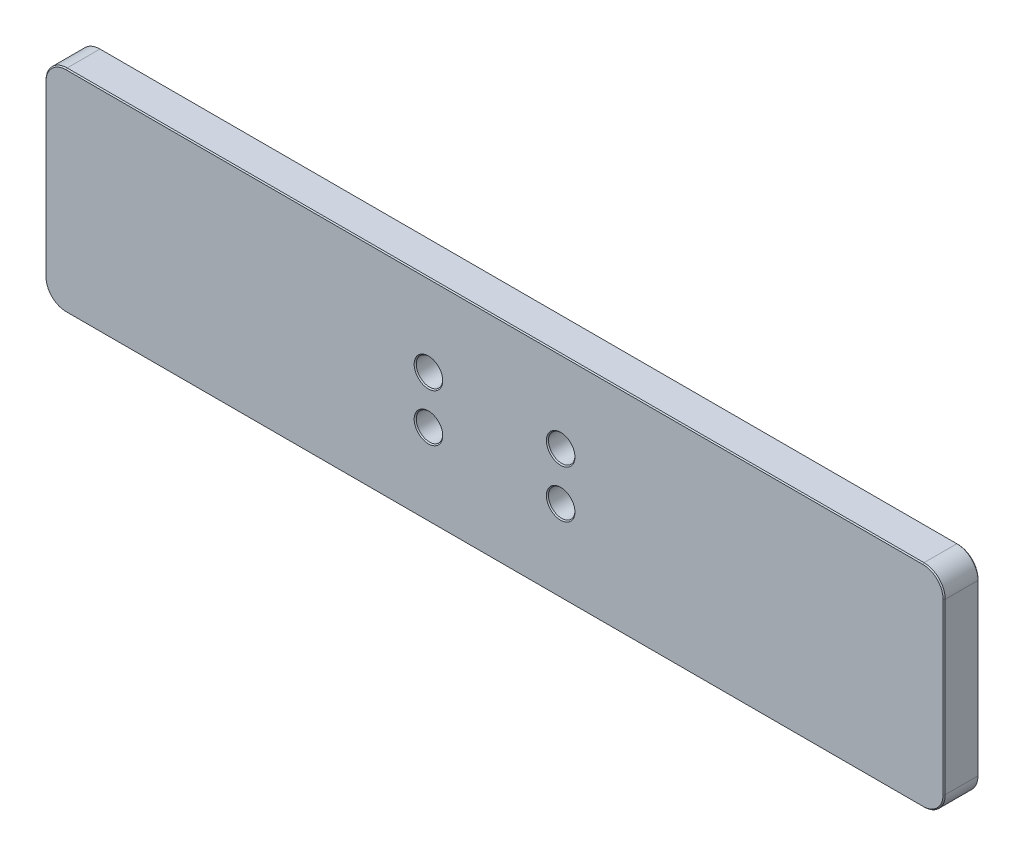
ISO-10303-21;
HEADER;
FILE_DESCRIPTION(('STEP AP214'),'2;1');
FILE_NAME('part.step','',(''),(''),'','','');
FILE_SCHEMA(('AUTOMOTIVE_DESIGN { 1 0 10303 214 1 1 1 1 }'));
ENDSEC;
DATA;
#1=APPLICATION_CONTEXT('core data for automotive mechanical design processes');
#2=APPLICATION_PROTOCOL_DEFINITION('international standard','automotive_design',2000,#1);
#3=PRODUCT_CONTEXT('',#1,'mechanical');
#4=PRODUCT('Part','Part','',(#3));
#5=PRODUCT_RELATED_PRODUCT_CATEGORY('part','',(#4));
#6=PRODUCT_DEFINITION_FORMATION('','',#4);
#7=PRODUCT_DEFINITION_CONTEXT('part definition',#1,'design');
#8=PRODUCT_DEFINITION('design','',#6,#7);
#9=PRODUCT_DEFINITION_SHAPE('','',#8);
#10=(LENGTH_UNIT() NAMED_UNIT(*) SI_UNIT(.MILLI.,.METRE.));
#11=(NAMED_UNIT(*) PLANE_ANGLE_UNIT() SI_UNIT($,.RADIAN.));
#12=(NAMED_UNIT(*) SI_UNIT($,.STERADIAN.) SOLID_ANGLE_UNIT());
#13=UNCERTAINTY_MEASURE_WITH_UNIT(LENGTH_MEASURE(1.E-05),#10,'distance_accuracy_value','');
#14=(GEOMETRIC_REPRESENTATION_CONTEXT(3) GLOBAL_UNCERTAINTY_ASSIGNED_CONTEXT((#13)) GLOBAL_UNIT_ASSIGNED_CONTEXT((#10,
#11,#12)) REPRESENTATION_CONTEXT('',''));
#15=CARTESIAN_POINT('',(0.,0.,0.));
#16=DIRECTION('',(0.,0.,1.));
#17=DIRECTION('',(1.,0.,0.));
#18=AXIS2_PLACEMENT_3D('',#15,#16,#17);
#19=CARTESIAN_POINT('',(0.,0.,8.382));
#20=DIRECTION('',(0.,0.,1.));
#21=DIRECTION('',(1.,0.,0.));
#22=AXIS2_PLACEMENT_3D('',#19,#20,#21);
#23=PLANE('',#22);
#24=CARTESIAN_POINT('',(-15.875,-5.715,8.382));
#25=DIRECTION('',(0.,0.,1.));
#26=DIRECTION('',(1.,0.,0.));
#27=AXIS2_PLACEMENT_3D('',#24,#25,#26);
#28=CIRCLE('',#27,3.42899999999999);
#29=CARTESIAN_POINT('',(-12.446,-5.715,8.382));
#30=VERTEX_POINT('',#29);
#31=EDGE_CURVE('E11',#30,#30,#28,.F.);
#32=ORIENTED_EDGE('',*,*,#31,.T.);
#33=EDGE_LOOP('',(#32));
#34=FACE_BOUND('',#33,.T.);
#35=CARTESIAN_POINT('',(15.875,5.715,8.382));
#36=DIRECTION('',(0.,0.,1.));
#37=DIRECTION('',(1.,0.,0.));
#38=AXIS2_PLACEMENT_3D('',#35,#36,#37);
#39=CIRCLE('',#38,3.42899999999999);
#40=CARTESIAN_POINT('',(19.304,5.715,8.382));
#41=VERTEX_POINT('',#40);
#42=EDGE_CURVE('E42',#41,#41,#39,.F.);
#43=ORIENTED_EDGE('',*,*,#42,.T.);
#44=EDGE_LOOP('',(#43));
#45=FACE_BOUND('',#44,.T.);
#46=DIRECTION('',(-1.,0.,0.));
#47=VECTOR('',#46,1.);
#48=CARTESIAN_POINT('',(-102.87,25.146,8.382));
#49=LINE('',#48,#47);
#50=CARTESIAN_POINT('',(102.87,25.146,8.382));
#51=VERTEX_POINT('',#50);
#52=CARTESIAN_POINT('',(-102.87,25.146,8.382));
#53=VERTEX_POINT('',#52);
#54=EDGE_CURVE('E50',#51,#53,#49,.T.);
#55=ORIENTED_EDGE('',*,*,#54,.T.);
#56=CARTESIAN_POINT('',(-102.87,20.32,8.382));
#57=DIRECTION('',(0.,0.,1.));
#58=DIRECTION('',(1.,0.,0.));
#59=AXIS2_PLACEMENT_3D('',#56,#57,#58);
#60=CIRCLE('',#59,4.82599999999997);
#61=CARTESIAN_POINT('',(-107.696,20.32,8.382));
#62=VERTEX_POINT('',#61);
#63=EDGE_CURVE('E265',#53,#62,#60,.T.);
#64=ORIENTED_EDGE('',*,*,#63,.T.);
#65=DIRECTION('',(0.,-1.,0.));
#66=VECTOR('',#65,1.);
#67=CARTESIAN_POINT('',(-107.696,-20.32,8.382));
#68=LINE('',#67,#66);
#69=CARTESIAN_POINT('',(-107.696,-20.32,8.382));
#70=VERTEX_POINT('',#69);
#71=EDGE_CURVE('E253',#62,#70,#68,.T.);
#72=ORIENTED_EDGE('',*,*,#71,.T.);
#73=CARTESIAN_POINT('',(-102.87,-20.32,8.382));
#74=DIRECTION('',(0.,0.,1.));
#75=DIRECTION('',(1.,0.,0.));
#76=AXIS2_PLACEMENT_3D('',#73,#74,#75);
#77=CIRCLE('',#76,4.82599999999997);
#78=CARTESIAN_POINT('',(-102.87,-25.146,8.382));
#79=VERTEX_POINT('',#78);
#80=EDGE_CURVE('E255',#70,#79,#77,.T.);
#81=ORIENTED_EDGE('',*,*,#80,.T.);
#82=DIRECTION('',(1.,0.,0.));
#83=VECTOR('',#82,1.);
#84=CARTESIAN_POINT('',(102.87,-25.146,8.382));
#85=LINE('',#84,#83);
#86=CARTESIAN_POINT('',(102.87,-25.146,8.382));
#87=VERTEX_POINT('',#86);
#88=EDGE_CURVE('E257',#79,#87,#85,.T.);
#89=ORIENTED_EDGE('',*,*,#88,.T.);
#90=CARTESIAN_POINT('',(102.87,-20.32,8.382));
#91=DIRECTION('',(0.,0.,1.));
#92=DIRECTION('',(1.,0.,0.));
#93=AXIS2_PLACEMENT_3D('',#90,#91,#92);
#94=CIRCLE('',#93,4.82599999999997);
#95=CARTESIAN_POINT('',(107.696,-20.32,8.382));
#96=VERTEX_POINT('',#95);
#97=EDGE_CURVE('E259',#87,#96,#94,.T.);
#98=ORIENTED_EDGE('',*,*,#97,.T.);
#99=DIRECTION('',(0.,1.,0.));
#100=VECTOR('',#99,1.);
#101=CARTESIAN_POINT('',(107.696,20.32,8.382));
#102=LINE('',#101,#100);
#103=CARTESIAN_POINT('',(107.696,20.32,8.382));
#104=VERTEX_POINT('',#103);
#105=EDGE_CURVE('E261',#96,#104,#102,.T.);
#106=ORIENTED_EDGE('',*,*,#105,.T.);
#107=CARTESIAN_POINT('',(102.87,20.32,8.382));
#108=DIRECTION('',(0.,0.,1.));
#109=DIRECTION('',(1.,0.,0.));
#110=AXIS2_PLACEMENT_3D('',#107,#108,#109);
#111=CIRCLE('',#110,4.82599999999997);
#112=EDGE_CURVE('E55',#104,#51,#111,.T.);
#113=ORIENTED_EDGE('',*,*,#112,.T.);
#114=EDGE_LOOP('',(#55,#64,#72,#81,#89,#98,#106,#113));
#115=FACE_BOUND('',#114,.T.);
#116=CARTESIAN_POINT('',(-15.875,5.715,8.382));
#117=DIRECTION('',(0.,0.,1.));
#118=DIRECTION('',(1.,0.,0.));
#119=AXIS2_PLACEMENT_3D('',#116,#117,#118);
#120=CIRCLE('',#119,3.42899999999999);
#121=CARTESIAN_POINT('',(-12.446,5.715,8.382));
#122=VERTEX_POINT('',#121);
#123=EDGE_CURVE('E250',#122,#122,#120,.F.);
#124=ORIENTED_EDGE('',*,*,#123,.T.);
#125=EDGE_LOOP('',(#124));
#126=FACE_BOUND('',#125,.T.);
#127=CARTESIAN_POINT('',(15.875,-5.715,8.382));
#128=DIRECTION('',(0.,0.,1.));
#129=DIRECTION('',(1.,0.,0.));
#130=AXIS2_PLACEMENT_3D('',#127,#128,#129);
#131=CIRCLE('',#130,3.42899999999999);
#132=CARTESIAN_POINT('',(19.304,-5.715,8.382));
#133=VERTEX_POINT('',#132);
#134=EDGE_CURVE('E247',#133,#133,#131,.F.);
#135=ORIENTED_EDGE('',*,*,#134,.T.);
#136=EDGE_LOOP('',(#135));
#137=FACE_BOUND('',#136,.T.);
#138=ADVANCED_FACE('F33',(#34,#45,#115,#126,#137),#23,.T.);
#139=CARTESIAN_POINT('',(0.,0.,0.));
#140=DIRECTION('',(0.,0.,1.));
#141=DIRECTION('',(1.,0.,0.));
#142=AXIS2_PLACEMENT_3D('',#139,#140,#141);
#143=PLANE('',#142);
#144=CARTESIAN_POINT('',(-15.875,-5.715,0.));
#145=DIRECTION('',(0.,0.,1.));
#146=DIRECTION('',(1.,0.,0.));
#147=AXIS2_PLACEMENT_3D('',#144,#145,#146);
#148=CIRCLE('',#147,3.42900000000004);
#149=CARTESIAN_POINT('',(-12.446,-5.715,0.));
#150=VERTEX_POINT('',#149);
#151=EDGE_CURVE('E188',#150,#150,#148,.T.);
#152=ORIENTED_EDGE('',*,*,#151,.T.);
#153=EDGE_LOOP('',(#152));
#154=FACE_BOUND('',#153,.T.);
#155=CARTESIAN_POINT('',(15.875,-5.715,0.));
#156=DIRECTION('',(0.,0.,1.));
#157=DIRECTION('',(1.,0.,0.));
#158=AXIS2_PLACEMENT_3D('',#155,#156,#157);
#159=CIRCLE('',#158,3.42900000000004);
#160=CARTESIAN_POINT('',(19.304,-5.715,0.));
#161=VERTEX_POINT('',#160);
#162=EDGE_CURVE('E185',#161,#161,#159,.T.);
#163=ORIENTED_EDGE('',*,*,#162,.T.);
#164=EDGE_LOOP('',(#163));
#165=FACE_BOUND('',#164,.T.);
#166=CARTESIAN_POINT('',(15.875,5.715,0.));
#167=DIRECTION('',(0.,0.,1.));
#168=DIRECTION('',(1.,0.,0.));
#169=AXIS2_PLACEMENT_3D('',#166,#167,#168);
#170=CIRCLE('',#169,3.42900000000004);
#171=CARTESIAN_POINT('',(19.304,5.715,0.));
#172=VERTEX_POINT('',#171);
#173=EDGE_CURVE('E177',#172,#172,#170,.T.);
#174=ORIENTED_EDGE('',*,*,#173,.T.);
#175=EDGE_LOOP('',(#174));
#176=FACE_BOUND('',#175,.T.);
#177=CARTESIAN_POINT('',(-15.875,5.715,0.));
#178=DIRECTION('',(0.,0.,1.));
#179=DIRECTION('',(1.,0.,0.));
#180=AXIS2_PLACEMENT_3D('',#177,#178,#179);
#181=CIRCLE('',#180,3.42900000000004);
#182=CARTESIAN_POINT('',(-12.446,5.715,0.));
#183=VERTEX_POINT('',#182);
#184=EDGE_CURVE('E174',#183,#183,#181,.T.);
#185=ORIENTED_EDGE('',*,*,#184,.T.);
#186=EDGE_LOOP('',(#185));
#187=FACE_BOUND('',#186,.T.);
#188=DIRECTION('',(0.,-1.,0.));
#189=VECTOR('',#188,1.);
#190=CARTESIAN_POINT('',(107.696,0.,0.));
#191=LINE('',#190,#189);
#192=CARTESIAN_POINT('',(107.696,20.32,0.));
#193=VERTEX_POINT('',#192);
#194=CARTESIAN_POINT('',(107.696,-20.32,0.));
#195=VERTEX_POINT('',#194);
#196=EDGE_CURVE('E172',#193,#195,#191,.T.);
#197=ORIENTED_EDGE('',*,*,#196,.T.);
#198=CARTESIAN_POINT('',(102.87,-20.32,0.));
#199=DIRECTION('',(0.,0.,1.));
#200=DIRECTION('',(1.,0.,0.));
#201=AXIS2_PLACEMENT_3D('',#198,#199,#200);
#202=CIRCLE('',#201,4.82600000000002);
#203=CARTESIAN_POINT('',(102.87,-25.146,0.));
#204=VERTEX_POINT('',#203);
#205=EDGE_CURVE('E153',#195,#204,#202,.F.);
#206=ORIENTED_EDGE('',*,*,#205,.T.);
#207=DIRECTION('',(-1.,0.,0.));
#208=VECTOR('',#207,1.);
#209=CARTESIAN_POINT('',(0.,-25.146,0.));
#210=LINE('',#209,#208);
#211=CARTESIAN_POINT('',(-102.87,-25.146,0.));
#212=VERTEX_POINT('',#211);
#213=EDGE_CURVE('E161',#204,#212,#210,.T.);
#214=ORIENTED_EDGE('',*,*,#213,.T.);
#215=CARTESIAN_POINT('',(-102.87,-20.32,0.));
#216=DIRECTION('',(0.,0.,1.));
#217=DIRECTION('',(1.,0.,0.));
#218=AXIS2_PLACEMENT_3D('',#215,#216,#217);
#219=CIRCLE('',#218,4.82600000000002);
#220=CARTESIAN_POINT('',(-107.696,-20.32,0.));
#221=VERTEX_POINT('',#220);
#222=EDGE_CURVE('E167',#212,#221,#219,.F.);
#223=ORIENTED_EDGE('',*,*,#222,.T.);
#224=DIRECTION('',(0.,1.,0.));
#225=VECTOR('',#224,1.);
#226=CARTESIAN_POINT('',(-107.696,0.,0.));
#227=LINE('',#226,#225);
#228=CARTESIAN_POINT('',(-107.696,20.32,0.));
#229=VERTEX_POINT('',#228);
#230=EDGE_CURVE('E350',#221,#229,#227,.T.);
#231=ORIENTED_EDGE('',*,*,#230,.T.);
#232=CARTESIAN_POINT('',(-102.87,20.32,0.));
#233=DIRECTION('',(0.,0.,1.));
#234=DIRECTION('',(1.,0.,0.));
#235=AXIS2_PLACEMENT_3D('',#232,#233,#234);
#236=CIRCLE('',#235,4.82600000000002);
#237=CARTESIAN_POINT('',(-102.87,25.146,0.));
#238=VERTEX_POINT('',#237);
#239=EDGE_CURVE('E352',#229,#238,#236,.F.);
#240=ORIENTED_EDGE('',*,*,#239,.T.);
#241=DIRECTION('',(1.,0.,0.));
#242=VECTOR('',#241,1.);
#243=CARTESIAN_POINT('',(0.,25.146,0.));
#244=LINE('',#243,#242);
#245=CARTESIAN_POINT('',(102.87,25.146,0.));
#246=VERTEX_POINT('',#245);
#247=EDGE_CURVE('E354',#238,#246,#244,.T.);
#248=ORIENTED_EDGE('',*,*,#247,.T.);
#249=CARTESIAN_POINT('',(102.87,20.32,0.));
#250=DIRECTION('',(0.,0.,1.));
#251=DIRECTION('',(1.,0.,0.));
#252=AXIS2_PLACEMENT_3D('',#249,#250,#251);
#253=CIRCLE('',#252,4.82600000000002);
#254=EDGE_CURVE('E179',#246,#193,#253,.F.);
#255=ORIENTED_EDGE('',*,*,#254,.T.);
#256=EDGE_LOOP('',(#197,#206,#214,#223,#231,#240,#248,#255));
#257=FACE_BOUND('',#256,.T.);
#258=ADVANCED_FACE('F170',(#154,#165,#176,#187,#257),#143,.F.);
#259=CARTESIAN_POINT('',(-107.95,-25.4,8.382));
#260=DIRECTION('',(1.,0.,0.));
#261=DIRECTION('',(0.,0.,-1.));
#262=AXIS2_PLACEMENT_3D('',#259,#260,#261);
#263=PLANE('',#262);
#264=DIRECTION('',(0.,0.,-1.));
#265=VECTOR('',#264,1.);
#266=CARTESIAN_POINT('',(-107.95,20.32,8.382));
#267=LINE('',#266,#265);
#268=CARTESIAN_POINT('',(-107.95,20.32,8.128));
#269=VERTEX_POINT('',#268);
#270=CARTESIAN_POINT('',(-107.95,20.32,0.253999999999976));
#271=VERTEX_POINT('',#270);
#272=EDGE_CURVE('E332',#269,#271,#267,.T.);
#273=ORIENTED_EDGE('',*,*,#272,.T.);
#274=DIRECTION('',(0.,-1.,0.));
#275=VECTOR('',#274,1.);
#276=CARTESIAN_POINT('',(-107.95,-25.4,0.253999999999976));
#277=LINE('',#276,#275);
#278=CARTESIAN_POINT('',(-107.95,-20.32,0.253999999999976));
#279=VERTEX_POINT('',#278);
#280=EDGE_CURVE('E237',#271,#279,#277,.T.);
#281=ORIENTED_EDGE('',*,*,#280,.T.);
#282=DIRECTION('',(0.,0.,-1.));
#283=VECTOR('',#282,1.);
#284=CARTESIAN_POINT('',(-107.95,-20.32,8.382));
#285=LINE('',#284,#283);
#286=CARTESIAN_POINT('',(-107.95,-20.32,8.128));
#287=VERTEX_POINT('',#286);
#288=EDGE_CURVE('E337',#279,#287,#285,.F.);
#289=ORIENTED_EDGE('',*,*,#288,.T.);
#290=DIRECTION('',(0.,1.,0.));
#291=VECTOR('',#290,1.);
#292=CARTESIAN_POINT('',(-107.95,20.32,8.128));
#293=LINE('',#292,#291);
#294=EDGE_CURVE('E235',#287,#269,#293,.T.);
#295=ORIENTED_EDGE('',*,*,#294,.T.);
#296=EDGE_LOOP('',(#273,#281,#289,#295));
#297=FACE_BOUND('',#296,.T.);
#298=ADVANCED_FACE('F395',(#297),#263,.F.);
#299=CARTESIAN_POINT('',(107.95,-25.4,8.382));
#300=DIRECTION('',(0.,1.,0.));
#301=DIRECTION('',(-1.,0.,0.));
#302=AXIS2_PLACEMENT_3D('',#299,#300,#301);
#303=PLANE('',#302);
#304=DIRECTION('',(0.,0.,-1.));
#305=VECTOR('',#304,1.);
#306=CARTESIAN_POINT('',(-102.87,-25.4,8.382));
#307=LINE('',#306,#305);
#308=CARTESIAN_POINT('',(-102.87,-25.4,8.128));
#309=VERTEX_POINT('',#308);
#310=CARTESIAN_POINT('',(-102.87,-25.4,0.253999999999976));
#311=VERTEX_POINT('',#310);
#312=EDGE_CURVE('E330',#309,#311,#307,.T.);
#313=ORIENTED_EDGE('',*,*,#312,.T.);
#314=DIRECTION('',(1.,0.,0.));
#315=VECTOR('',#314,1.);
#316=CARTESIAN_POINT('',(107.95,-25.4,0.253999999999976));
#317=LINE('',#316,#315);
#318=CARTESIAN_POINT('',(102.87,-25.4,0.253999999999976));
#319=VERTEX_POINT('',#318);
#320=EDGE_CURVE('E245',#311,#319,#317,.T.);
#321=ORIENTED_EDGE('',*,*,#320,.T.);
#322=DIRECTION('',(0.,0.,-1.));
#323=VECTOR('',#322,1.);
#324=CARTESIAN_POINT('',(102.87,-25.4,8.382));
#325=LINE('',#324,#323);
#326=CARTESIAN_POINT('',(102.87,-25.4,8.128));
#327=VERTEX_POINT('',#326);
#328=EDGE_CURVE('E286',#319,#327,#325,.F.);
#329=ORIENTED_EDGE('',*,*,#328,.T.);
#330=DIRECTION('',(-1.,0.,0.));
#331=VECTOR('',#330,1.);
#332=CARTESIAN_POINT('',(-102.87,-25.4,8.128));
#333=LINE('',#332,#331);
#334=EDGE_CURVE('E243',#327,#309,#333,.T.);
#335=ORIENTED_EDGE('',*,*,#334,.T.);
#336=EDGE_LOOP('',(#313,#321,#329,#335));
#337=FACE_BOUND('',#336,.T.);
#338=ADVANCED_FACE('F328',(#337),#303,.F.);
#339=CARTESIAN_POINT('',(107.95,-25.4,8.382));
#340=DIRECTION('',(-1.,0.,0.));
#341=DIRECTION('',(0.,0.,1.));
#342=AXIS2_PLACEMENT_3D('',#339,#340,#341);
#343=PLANE('',#342);
#344=DIRECTION('',(0.,0.,-1.));
#345=VECTOR('',#344,1.);
#346=CARTESIAN_POINT('',(107.95,-20.32,8.382));
#347=LINE('',#346,#345);
#348=CARTESIAN_POINT('',(107.95,-20.32,8.128));
#349=VERTEX_POINT('',#348);
#350=CARTESIAN_POINT('',(107.95,-20.32,0.253999999999976));
#351=VERTEX_POINT('',#350);
#352=EDGE_CURVE('E325',#349,#351,#347,.T.);
#353=ORIENTED_EDGE('',*,*,#352,.T.);
#354=DIRECTION('',(0.,1.,0.));
#355=VECTOR('',#354,1.);
#356=CARTESIAN_POINT('',(107.95,-25.4,0.253999999999976));
#357=LINE('',#356,#355);
#358=CARTESIAN_POINT('',(107.95,20.32,0.253999999999976));
#359=VERTEX_POINT('',#358);
#360=EDGE_CURVE('E220',#351,#359,#357,.T.);
#361=ORIENTED_EDGE('',*,*,#360,.T.);
#362=DIRECTION('',(0.,0.,-1.));
#363=VECTOR('',#362,1.);
#364=CARTESIAN_POINT('',(107.95,20.32,8.382));
#365=LINE('',#364,#363);
#366=CARTESIAN_POINT('',(107.95,20.32,8.128));
#367=VERTEX_POINT('',#366);
#368=EDGE_CURVE('E340',#359,#367,#365,.F.);
#369=ORIENTED_EDGE('',*,*,#368,.T.);
#370=DIRECTION('',(0.,-1.,0.));
#371=VECTOR('',#370,1.);
#372=CARTESIAN_POINT('',(107.95,-20.32,8.128));
#373=LINE('',#372,#371);
#374=EDGE_CURVE('E218',#367,#349,#373,.T.);
#375=ORIENTED_EDGE('',*,*,#374,.T.);
#376=EDGE_LOOP('',(#353,#361,#369,#375));
#377=FACE_BOUND('',#376,.T.);
#378=ADVANCED_FACE('F367',(#377),#343,.F.);
#379=CARTESIAN_POINT('',(107.95,25.4,8.382));
#380=DIRECTION('',(0.,-1.,0.));
#381=DIRECTION('',(1.,0.,0.));
#382=AXIS2_PLACEMENT_3D('',#379,#380,#381);
#383=PLANE('',#382);
#384=DIRECTION('',(0.,0.,-1.));
#385=VECTOR('',#384,1.);
#386=CARTESIAN_POINT('',(102.87,25.4,8.382));
#387=LINE('',#386,#385);
#388=CARTESIAN_POINT('',(102.87,25.4,8.128));
#389=VERTEX_POINT('',#388);
#390=CARTESIAN_POINT('',(102.87,25.4,0.253999999999976));
#391=VERTEX_POINT('',#390);
#392=EDGE_CURVE('E168',#389,#391,#387,.T.);
#393=ORIENTED_EDGE('',*,*,#392,.T.);
#394=DIRECTION('',(-1.,0.,0.));
#395=VECTOR('',#394,1.);
#396=CARTESIAN_POINT('',(107.95,25.4,0.253999999999976));
#397=LINE('',#396,#395);
#398=CARTESIAN_POINT('',(-102.87,25.4,0.253999999999976));
#399=VERTEX_POINT('',#398);
#400=EDGE_CURVE('E228',#391,#399,#397,.T.);
#401=ORIENTED_EDGE('',*,*,#400,.T.);
#402=DIRECTION('',(0.,0.,-1.));
#403=VECTOR('',#402,1.);
#404=CARTESIAN_POINT('',(-102.87,25.4,8.382));
#405=LINE('',#404,#403);
#406=CARTESIAN_POINT('',(-102.87,25.4,8.128));
#407=VERTEX_POINT('',#406);
#408=EDGE_CURVE('E344',#399,#407,#405,.F.);
#409=ORIENTED_EDGE('',*,*,#408,.T.);
#410=DIRECTION('',(1.,0.,0.));
#411=VECTOR('',#410,1.);
#412=CARTESIAN_POINT('',(102.87,25.4,8.128));
#413=LINE('',#412,#411);
#414=EDGE_CURVE('E226',#407,#389,#413,.T.);
#415=ORIENTED_EDGE('',*,*,#414,.T.);
#416=EDGE_LOOP('',(#393,#401,#409,#415));
#417=FACE_BOUND('',#416,.T.);
#418=ADVANCED_FACE('F411',(#417),#383,.F.);
#419=CARTESIAN_POINT('',(-15.875,5.715,8.382));
#420=DIRECTION('',(0.,0.,-1.));
#421=DIRECTION('',(-1.,0.,0.));
#422=AXIS2_PLACEMENT_3D('',#419,#420,#421);
#423=CYLINDRICAL_SURFACE('',#422,3.175);
#424=CARTESIAN_POINT('',(-15.875,5.715,0.254000000000025));
#425=DIRECTION('',(0.,0.,1.));
#426=DIRECTION('',(1.,0.,0.));
#427=AXIS2_PLACEMENT_3D('',#424,#425,#426);
#428=CIRCLE('',#427,3.175);
#429=CARTESIAN_POINT('',(-12.7,5.715,0.254000000000025));
#430=VERTEX_POINT('',#429);
#431=EDGE_CURVE('E212',#430,#430,#428,.F.);
#432=ORIENTED_EDGE('',*,*,#431,.T.);
#433=EDGE_LOOP('',(#432));
#434=FACE_BOUND('',#433,.T.);
#435=CARTESIAN_POINT('',(-15.875,5.715,8.12800000000001));
#436=DIRECTION('',(0.,0.,1.));
#437=DIRECTION('',(1.,0.,0.));
#438=AXIS2_PLACEMENT_3D('',#435,#436,#437);
#439=CIRCLE('',#438,3.175);
#440=CARTESIAN_POINT('',(-12.7,5.715,8.12800000000001));
#441=VERTEX_POINT('',#440);
#442=EDGE_CURVE('E209',#441,#441,#439,.T.);
#443=ORIENTED_EDGE('',*,*,#442,.T.);
#444=EDGE_LOOP('',(#443));
#445=FACE_BOUND('',#444,.T.);
#446=ADVANCED_FACE('F413',(#434,#445),#423,.F.);
#447=CARTESIAN_POINT('',(15.875,5.715,8.382));
#448=DIRECTION('',(0.,0.,-1.));
#449=DIRECTION('',(-1.,0.,0.));
#450=AXIS2_PLACEMENT_3D('',#447,#448,#449);
#451=CYLINDRICAL_SURFACE('',#450,3.175);
#452=CARTESIAN_POINT('',(15.875,5.715,0.254000000000037));
#453=DIRECTION('',(0.,0.,1.));
#454=DIRECTION('',(1.,0.,0.));
#455=AXIS2_PLACEMENT_3D('',#452,#453,#454);
#456=CIRCLE('',#455,3.175);
#457=CARTESIAN_POINT('',(19.05,5.715,0.254000000000037));
#458=VERTEX_POINT('',#457);
#459=EDGE_CURVE('E206',#458,#458,#456,.F.);
#460=ORIENTED_EDGE('',*,*,#459,.T.);
#461=EDGE_LOOP('',(#460));
#462=FACE_BOUND('',#461,.T.);
#463=CARTESIAN_POINT('',(15.875,5.715,8.12800000000001));
#464=DIRECTION('',(0.,0.,1.));
#465=DIRECTION('',(1.,0.,0.));
#466=AXIS2_PLACEMENT_3D('',#463,#464,#465);
#467=CIRCLE('',#466,3.175);
#468=CARTESIAN_POINT('',(19.05,5.715,8.12800000000001));
#469=VERTEX_POINT('',#468);
#470=EDGE_CURVE('E203',#469,#469,#467,.T.);
#471=ORIENTED_EDGE('',*,*,#470,.T.);
#472=EDGE_LOOP('',(#471));
#473=FACE_BOUND('',#472,.T.);
#474=ADVANCED_FACE('F419',(#462,#473),#451,.F.);
#475=CARTESIAN_POINT('',(15.875,-5.715,8.382));
#476=DIRECTION('',(0.,0.,-1.));
#477=DIRECTION('',(-1.,0.,0.));
#478=AXIS2_PLACEMENT_3D('',#475,#476,#477);
#479=CYLINDRICAL_SURFACE('',#478,3.175);
#480=CARTESIAN_POINT('',(15.875,-5.715,0.254000000000037));
#481=DIRECTION('',(0.,0.,1.));
#482=DIRECTION('',(1.,0.,0.));
#483=AXIS2_PLACEMENT_3D('',#480,#481,#482);
#484=CIRCLE('',#483,3.175);
#485=CARTESIAN_POINT('',(19.05,-5.715,0.254000000000037));
#486=VERTEX_POINT('',#485);
#487=EDGE_CURVE('E200',#486,#486,#484,.F.);
#488=ORIENTED_EDGE('',*,*,#487,.T.);
#489=EDGE_LOOP('',(#488));
#490=FACE_BOUND('',#489,.T.);
#491=CARTESIAN_POINT('',(15.875,-5.715,8.12800000000001));
#492=DIRECTION('',(0.,0.,1.));
#493=DIRECTION('',(1.,0.,0.));
#494=AXIS2_PLACEMENT_3D('',#491,#492,#493);
#495=CIRCLE('',#494,3.175);
#496=CARTESIAN_POINT('',(19.05,-5.715,8.12800000000001));
#497=VERTEX_POINT('',#496);
#498=EDGE_CURVE('E197',#497,#497,#495,.T.);
#499=ORIENTED_EDGE('',*,*,#498,.T.);
#500=EDGE_LOOP('',(#499));
#501=FACE_BOUND('',#500,.T.);
#502=ADVANCED_FACE('F435',(#490,#501),#479,.F.);
#503=CARTESIAN_POINT('',(-15.875,-5.715,8.382));
#504=DIRECTION('',(0.,0.,-1.));
#505=DIRECTION('',(-1.,0.,0.));
#506=AXIS2_PLACEMENT_3D('',#503,#504,#505);
#507=CYLINDRICAL_SURFACE('',#506,3.175);
#508=CARTESIAN_POINT('',(-15.875,-5.715,0.254000000000025));
#509=DIRECTION('',(0.,0.,1.));
#510=DIRECTION('',(1.,0.,0.));
#511=AXIS2_PLACEMENT_3D('',#508,#509,#510);
#512=CIRCLE('',#511,3.175);
#513=CARTESIAN_POINT('',(-12.7,-5.715,0.254000000000025));
#514=VERTEX_POINT('',#513);
#515=EDGE_CURVE('E194',#514,#514,#512,.F.);
#516=ORIENTED_EDGE('',*,*,#515,.T.);
#517=EDGE_LOOP('',(#516));
#518=FACE_BOUND('',#517,.T.);
#519=CARTESIAN_POINT('',(-15.875,-5.715,8.12800000000001));
#520=DIRECTION('',(0.,0.,1.));
#521=DIRECTION('',(1.,0.,0.));
#522=AXIS2_PLACEMENT_3D('',#519,#520,#521);
#523=CIRCLE('',#522,3.175);
#524=CARTESIAN_POINT('',(-12.7,-5.715,8.12800000000001));
#525=VERTEX_POINT('',#524);
#526=EDGE_CURVE('E191',#525,#525,#523,.T.);
#527=ORIENTED_EDGE('',*,*,#526,.T.);
#528=EDGE_LOOP('',(#527));
#529=FACE_BOUND('',#528,.T.);
#530=ADVANCED_FACE('F439',(#518,#529),#507,.F.);
#531=CARTESIAN_POINT('',(-102.87,-20.32,8.382));
#532=DIRECTION('',(0.,0.,-1.));
#533=DIRECTION('',(-1.,0.,0.));
#534=AXIS2_PLACEMENT_3D('',#531,#532,#533);
#535=CYLINDRICAL_SURFACE('',#534,5.08);
#536=ORIENTED_EDGE('',*,*,#288,.F.);
#537=CARTESIAN_POINT('',(-102.87,-20.32,0.253999999999976));
#538=DIRECTION('',(0.,0.,1.));
#539=DIRECTION('',(1.,0.,0.));
#540=AXIS2_PLACEMENT_3D('',#537,#538,#539);
#541=CIRCLE('',#540,5.08);
#542=EDGE_CURVE('E241',#279,#311,#541,.T.);
#543=ORIENTED_EDGE('',*,*,#542,.T.);
#544=ORIENTED_EDGE('',*,*,#312,.F.);
#545=CARTESIAN_POINT('',(-102.87,-20.32,8.128));
#546=DIRECTION('',(0.,0.,1.));
#547=DIRECTION('',(1.,0.,0.));
#548=AXIS2_PLACEMENT_3D('',#545,#546,#547);
#549=CIRCLE('',#548,5.08);
#550=EDGE_CURVE('E239',#309,#287,#549,.F.);
#551=ORIENTED_EDGE('',*,*,#550,.T.);
#552=EDGE_LOOP('',(#536,#543,#544,#551));
#553=FACE_BOUND('',#552,.T.);
#554=ADVANCED_FACE('F442',(#553),#535,.T.);
#555=CARTESIAN_POINT('',(102.87,-20.32,8.382));
#556=DIRECTION('',(0.,0.,-1.));
#557=DIRECTION('',(-1.,0.,0.));
#558=AXIS2_PLACEMENT_3D('',#555,#556,#557);
#559=CYLINDRICAL_SURFACE('',#558,5.08);
#560=ORIENTED_EDGE('',*,*,#328,.F.);
#561=CARTESIAN_POINT('',(102.87,-20.32,0.253999999999976));
#562=DIRECTION('',(0.,0.,1.));
#563=DIRECTION('',(1.,0.,0.));
#564=AXIS2_PLACEMENT_3D('',#561,#562,#563);
#565=CIRCLE('',#564,5.08);
#566=EDGE_CURVE('E155',#319,#351,#565,.T.);
#567=ORIENTED_EDGE('',*,*,#566,.T.);
#568=ORIENTED_EDGE('',*,*,#352,.F.);
#569=CARTESIAN_POINT('',(102.87,-20.32,8.128));
#570=DIRECTION('',(0.,0.,1.));
#571=DIRECTION('',(1.,0.,0.));
#572=AXIS2_PLACEMENT_3D('',#569,#570,#571);
#573=CIRCLE('',#572,5.08);
#574=EDGE_CURVE('E215',#349,#327,#573,.F.);
#575=ORIENTED_EDGE('',*,*,#574,.T.);
#576=EDGE_LOOP('',(#560,#567,#568,#575));
#577=FACE_BOUND('',#576,.T.);
#578=ADVANCED_FACE('F323',(#577),#559,.T.);
#579=CARTESIAN_POINT('',(102.87,20.32,8.382));
#580=DIRECTION('',(0.,0.,-1.));
#581=DIRECTION('',(-1.,0.,0.));
#582=AXIS2_PLACEMENT_3D('',#579,#580,#581);
#583=CYLINDRICAL_SURFACE('',#582,5.08);
#584=ORIENTED_EDGE('',*,*,#368,.F.);
#585=CARTESIAN_POINT('',(102.87,20.32,0.253999999999976));
#586=DIRECTION('',(0.,0.,1.));
#587=DIRECTION('',(1.,0.,0.));
#588=AXIS2_PLACEMENT_3D('',#585,#586,#587);
#589=CIRCLE('',#588,5.08);
#590=EDGE_CURVE('E224',#359,#391,#589,.T.);
#591=ORIENTED_EDGE('',*,*,#590,.T.);
#592=ORIENTED_EDGE('',*,*,#392,.F.);
#593=CARTESIAN_POINT('',(102.87,20.32,8.128));
#594=DIRECTION('',(0.,0.,1.));
#595=DIRECTION('',(1.,0.,0.));
#596=AXIS2_PLACEMENT_3D('',#593,#594,#595);
#597=CIRCLE('',#596,5.08);
#598=EDGE_CURVE('E222',#389,#367,#597,.F.);
#599=ORIENTED_EDGE('',*,*,#598,.T.);
#600=EDGE_LOOP('',(#584,#591,#592,#599));
#601=FACE_BOUND('',#600,.T.);
#602=ADVANCED_FACE('F369',(#601),#583,.T.);
#603=CARTESIAN_POINT('',(-102.87,20.32,8.382));
#604=DIRECTION('',(0.,0.,-1.));
#605=DIRECTION('',(-1.,0.,0.));
#606=AXIS2_PLACEMENT_3D('',#603,#604,#605);
#607=CYLINDRICAL_SURFACE('',#606,5.08);
#608=ORIENTED_EDGE('',*,*,#408,.F.);
#609=CARTESIAN_POINT('',(-102.87,20.32,0.253999999999976));
#610=DIRECTION('',(0.,0.,1.));
#611=DIRECTION('',(1.,0.,0.));
#612=AXIS2_PLACEMENT_3D('',#609,#610,#611);
#613=CIRCLE('',#612,5.08);
#614=EDGE_CURVE('E233',#399,#271,#613,.T.);
#615=ORIENTED_EDGE('',*,*,#614,.T.);
#616=ORIENTED_EDGE('',*,*,#272,.F.);
#617=CARTESIAN_POINT('',(-102.87,20.32,8.128));
#618=DIRECTION('',(0.,0.,1.));
#619=DIRECTION('',(1.,0.,0.));
#620=AXIS2_PLACEMENT_3D('',#617,#618,#619);
#621=CIRCLE('',#620,5.08);
#622=EDGE_CURVE('E230',#269,#407,#621,.F.);
#623=ORIENTED_EDGE('',*,*,#622,.T.);
#624=EDGE_LOOP('',(#608,#615,#616,#623));
#625=FACE_BOUND('',#624,.T.);
#626=ADVANCED_FACE('F400',(#625),#607,.T.);
#627=CARTESIAN_POINT('',(-15.875,-5.715,0.));
#628=DIRECTION('',(0.,0.,-1.));
#629=DIRECTION('',(-1.,0.,0.));
#630=AXIS2_PLACEMENT_3D('',#627,#628,#629);
#631=CONICAL_SURFACE('',#630,3.42900000000004,0.785398163397482);
#632=ORIENTED_EDGE('',*,*,#515,.F.);
#633=EDGE_LOOP('',(#632));
#634=FACE_BOUND('',#633,.T.);
#635=ORIENTED_EDGE('',*,*,#151,.F.);
#636=EDGE_LOOP('',(#635));
#637=FACE_BOUND('',#636,.T.);
#638=ADVANCED_FACE('F659',(#634,#637),#631,.F.);
#639=CARTESIAN_POINT('',(15.875,-5.715,0.));
#640=DIRECTION('',(0.,0.,-1.));
#641=DIRECTION('',(-1.,0.,0.));
#642=AXIS2_PLACEMENT_3D('',#639,#640,#641);
#643=CONICAL_SURFACE('',#642,3.42900000000004,0.785398163397458);
#644=ORIENTED_EDGE('',*,*,#487,.F.);
#645=EDGE_LOOP('',(#644));
#646=FACE_BOUND('',#645,.T.);
#647=ORIENTED_EDGE('',*,*,#162,.F.);
#648=EDGE_LOOP('',(#647));
#649=FACE_BOUND('',#648,.T.);
#650=ADVANCED_FACE('F649',(#646,#649),#643,.F.);
#651=CARTESIAN_POINT('',(15.875,5.715,0.));
#652=DIRECTION('',(0.,0.,-1.));
#653=DIRECTION('',(-1.,0.,0.));
#654=AXIS2_PLACEMENT_3D('',#651,#652,#653);
#655=CONICAL_SURFACE('',#654,3.42900000000004,0.785398163397458);
#656=ORIENTED_EDGE('',*,*,#459,.F.);
#657=EDGE_LOOP('',(#656));
#658=FACE_BOUND('',#657,.T.);
#659=ORIENTED_EDGE('',*,*,#173,.F.);
#660=EDGE_LOOP('',(#659));
#661=FACE_BOUND('',#660,.T.);
#662=ADVANCED_FACE('F639',(#658,#661),#655,.F.);
#663=CARTESIAN_POINT('',(-15.875,5.715,0.));
#664=DIRECTION('',(0.,0.,-1.));
#665=DIRECTION('',(-1.,0.,0.));
#666=AXIS2_PLACEMENT_3D('',#663,#664,#665);
#667=CONICAL_SURFACE('',#666,3.42900000000004,0.785398163397482);
#668=ORIENTED_EDGE('',*,*,#431,.F.);
#669=EDGE_LOOP('',(#668));
#670=FACE_BOUND('',#669,.T.);
#671=ORIENTED_EDGE('',*,*,#184,.F.);
#672=EDGE_LOOP('',(#671));
#673=FACE_BOUND('',#672,.T.);
#674=ADVANCED_FACE('F631',(#670,#673),#667,.F.);
#675=CARTESIAN_POINT('',(-102.87,20.32,0.));
#676=DIRECTION('',(0.,0.,1.));
#677=DIRECTION('',(1.,0.,0.));
#678=AXIS2_PLACEMENT_3D('',#675,#676,#677);
#679=CONICAL_SURFACE('',#678,4.82600000000002,0.785398163397447);
#680=DIRECTION('',(0.707106781186547,0.,-0.707106781186548));
#681=VECTOR('',#680,1.);
#682=CARTESIAN_POINT('',(-107.95,20.32,0.253999999999977));
#683=LINE('',#682,#681);
#684=EDGE_CURVE('E280',#271,#229,#683,.T.);
#685=ORIENTED_EDGE('',*,*,#684,.F.);
#686=ORIENTED_EDGE('',*,*,#614,.F.);
#687=DIRECTION('',(0.,0.707106781186547,0.707106781186548));
#688=VECTOR('',#687,1.);
#689=CARTESIAN_POINT('',(-102.87,25.146,0.));
#690=LINE('',#689,#688);
#691=EDGE_CURVE('E283',#238,#399,#690,.T.);
#692=ORIENTED_EDGE('',*,*,#691,.F.);
#693=ORIENTED_EDGE('',*,*,#239,.F.);
#694=EDGE_LOOP('',(#685,#686,#692,#693));
#695=FACE_BOUND('',#694,.T.);
#696=ADVANCED_FACE('F404',(#695),#679,.T.);
#697=CARTESIAN_POINT('',(107.95,25.4,0.253999999999976));
#698=DIRECTION('',(0.,-0.707106781186548,0.707106781186548));
#699=DIRECTION('',(-1.,0.,0.));
#700=AXIS2_PLACEMENT_3D('',#697,#698,#699);
#701=PLANE('',#700);
#702=ORIENTED_EDGE('',*,*,#691,.T.);
#703=ORIENTED_EDGE('',*,*,#400,.F.);
#704=DIRECTION('',(0.,0.707106781186548,0.707106781186548));
#705=VECTOR('',#704,1.);
#706=CARTESIAN_POINT('',(102.87,25.146,0.));
#707=LINE('',#706,#705);
#708=EDGE_CURVE('E277',#246,#391,#707,.T.);
#709=ORIENTED_EDGE('',*,*,#708,.F.);
#710=ORIENTED_EDGE('',*,*,#247,.F.);
#711=EDGE_LOOP('',(#702,#703,#709,#710));
#712=FACE_BOUND('',#711,.T.);
#713=ADVANCED_FACE('F409',(#712),#701,.F.);
#714=CARTESIAN_POINT('',(-107.95,-25.4,0.253999999999976));
#715=DIRECTION('',(0.707106781186548,0.,0.707106781186548));
#716=DIRECTION('',(0.,-1.,0.));
#717=AXIS2_PLACEMENT_3D('',#714,#715,#716);
#718=PLANE('',#717);
#719=ORIENTED_EDGE('',*,*,#684,.T.);
#720=ORIENTED_EDGE('',*,*,#230,.F.);
#721=DIRECTION('',(0.707106781186548,0.,-0.707106781186548));
#722=VECTOR('',#721,1.);
#723=CARTESIAN_POINT('',(-107.95,-20.32,0.253999999999976));
#724=LINE('',#723,#722);
#725=EDGE_CURVE('E274',#279,#221,#724,.T.);
#726=ORIENTED_EDGE('',*,*,#725,.F.);
#727=ORIENTED_EDGE('',*,*,#280,.F.);
#728=EDGE_LOOP('',(#719,#720,#726,#727));
#729=FACE_BOUND('',#728,.T.);
#730=ADVANCED_FACE('F606',(#729),#718,.F.);
#731=CARTESIAN_POINT('',(102.87,20.32,0.));
#732=DIRECTION('',(0.,0.,1.));
#733=DIRECTION('',(1.,0.,0.));
#734=AXIS2_PLACEMENT_3D('',#731,#732,#733);
#735=CONICAL_SURFACE('',#734,4.82600000000002,0.785398163397447);
#736=ORIENTED_EDGE('',*,*,#708,.T.);
#737=ORIENTED_EDGE('',*,*,#590,.F.);
#738=DIRECTION('',(0.707106781186547,0.,0.707106781186548));
#739=VECTOR('',#738,1.);
#740=CARTESIAN_POINT('',(107.696,20.32,0.));
#741=LINE('',#740,#739);
#742=EDGE_CURVE('E271',#193,#359,#741,.T.);
#743=ORIENTED_EDGE('',*,*,#742,.F.);
#744=ORIENTED_EDGE('',*,*,#254,.F.);
#745=EDGE_LOOP('',(#736,#737,#743,#744));
#746=FACE_BOUND('',#745,.T.);
#747=ADVANCED_FACE('F361',(#746),#735,.T.);
#748=CARTESIAN_POINT('',(-102.87,-20.32,0.));
#749=DIRECTION('',(0.,0.,1.));
#750=DIRECTION('',(1.,0.,0.));
#751=AXIS2_PLACEMENT_3D('',#748,#749,#750);
#752=CONICAL_SURFACE('',#751,4.82600000000002,0.785398163397447);
#753=ORIENTED_EDGE('',*,*,#725,.T.);
#754=ORIENTED_EDGE('',*,*,#222,.F.);
#755=DIRECTION('',(0.,0.707106781186547,-0.707106781186548));
#756=VECTOR('',#755,1.);
#757=CARTESIAN_POINT('',(-102.87,-25.4,0.253999999999977));
#758=LINE('',#757,#756);
#759=EDGE_CURVE('E164',#311,#212,#758,.T.);
#760=ORIENTED_EDGE('',*,*,#759,.F.);
#761=ORIENTED_EDGE('',*,*,#542,.F.);
#762=EDGE_LOOP('',(#753,#754,#760,#761));
#763=FACE_BOUND('',#762,.T.);
#764=ADVANCED_FACE('F588',(#763),#752,.T.);
#765=CARTESIAN_POINT('',(107.95,-25.4,0.253999999999976));
#766=DIRECTION('',(-0.707106781186548,0.,0.707106781186548));
#767=DIRECTION('',(0.,1.,0.));
#768=AXIS2_PLACEMENT_3D('',#765,#766,#767);
#769=PLANE('',#768);
#770=ORIENTED_EDGE('',*,*,#742,.T.);
#771=ORIENTED_EDGE('',*,*,#360,.F.);
#772=DIRECTION('',(0.707106781186548,0.,0.707106781186548));
#773=VECTOR('',#772,1.);
#774=CARTESIAN_POINT('',(107.696,-20.32,0.));
#775=LINE('',#774,#773);
#776=EDGE_CURVE('E158',#195,#351,#775,.T.);
#777=ORIENTED_EDGE('',*,*,#776,.F.);
#778=ORIENTED_EDGE('',*,*,#196,.F.);
#779=EDGE_LOOP('',(#770,#771,#777,#778));
#780=FACE_BOUND('',#779,.T.);
#781=ADVANCED_FACE('F364',(#780),#769,.F.);
#782=CARTESIAN_POINT('',(107.95,-25.4,0.253999999999976));
#783=DIRECTION('',(0.,0.707106781186548,0.707106781186548));
#784=DIRECTION('',(1.,0.,0.));
#785=AXIS2_PLACEMENT_3D('',#782,#783,#784);
#786=PLANE('',#785);
#787=ORIENTED_EDGE('',*,*,#759,.T.);
#788=ORIENTED_EDGE('',*,*,#213,.F.);
#789=DIRECTION('',(0.,0.707106781186548,-0.707106781186548));
#790=VECTOR('',#789,1.);
#791=CARTESIAN_POINT('',(102.87,-25.4,0.253999999999976));
#792=LINE('',#791,#790);
#793=EDGE_CURVE('E149',#319,#204,#792,.T.);
#794=ORIENTED_EDGE('',*,*,#793,.F.);
#795=ORIENTED_EDGE('',*,*,#320,.F.);
#796=EDGE_LOOP('',(#787,#788,#794,#795));
#797=FACE_BOUND('',#796,.T.);
#798=ADVANCED_FACE('F162',(#797),#786,.F.);
#799=CARTESIAN_POINT('',(102.87,-20.32,0.));
#800=DIRECTION('',(0.,0.,1.));
#801=DIRECTION('',(1.,0.,0.));
#802=AXIS2_PLACEMENT_3D('',#799,#800,#801);
#803=CONICAL_SURFACE('',#802,4.82600000000002,0.785398163397447);
#804=ORIENTED_EDGE('',*,*,#776,.T.);
#805=ORIENTED_EDGE('',*,*,#566,.F.);
#806=ORIENTED_EDGE('',*,*,#793,.T.);
#807=ORIENTED_EDGE('',*,*,#205,.F.);
#808=EDGE_LOOP('',(#804,#805,#806,#807));
#809=FACE_BOUND('',#808,.T.);
#810=ADVANCED_FACE('F151',(#809),#803,.T.);
#811=CARTESIAN_POINT('',(-15.875,-5.715,8.12800000000001));
#812=DIRECTION('',(0.,0.,1.));
#813=DIRECTION('',(1.,0.,0.));
#814=AXIS2_PLACEMENT_3D('',#811,#812,#813);
#815=CONICAL_SURFACE('',#814,3.175,0.785398163397441);
#816=ORIENTED_EDGE('',*,*,#31,.F.);
#817=EDGE_LOOP('',(#816));
#818=FACE_BOUND('',#817,.T.);
#819=ORIENTED_EDGE('',*,*,#526,.F.);
#820=EDGE_LOOP('',(#819));
#821=FACE_BOUND('',#820,.T.);
#822=ADVANCED_FACE('F453',(#818,#821),#815,.F.);
#823=CARTESIAN_POINT('',(15.875,5.715,8.12800000000001));
#824=DIRECTION('',(0.,0.,1.));
#825=DIRECTION('',(1.,0.,0.));
#826=AXIS2_PLACEMENT_3D('',#823,#824,#825);
#827=CONICAL_SURFACE('',#826,3.175,0.785398163397441);
#828=ORIENTED_EDGE('',*,*,#42,.F.);
#829=EDGE_LOOP('',(#828));
#830=FACE_BOUND('',#829,.T.);
#831=ORIENTED_EDGE('',*,*,#470,.F.);
#832=EDGE_LOOP('',(#831));
#833=FACE_BOUND('',#832,.T.);
#834=ADVANCED_FACE('F455',(#830,#833),#827,.F.);
#835=CARTESIAN_POINT('',(102.87,-20.32,8.382));
#836=DIRECTION('',(0.,0.,-1.));
#837=DIRECTION('',(-1.,0.,0.));
#838=AXIS2_PLACEMENT_3D('',#835,#836,#837);
#839=CONICAL_SURFACE('',#838,4.82599999999997,0.785398163397501);
#840=DIRECTION('',(0.,0.707106781186586,0.707106781186509));
#841=VECTOR('',#840,1.);
#842=CARTESIAN_POINT('',(102.87,-25.4,8.128));
#843=LINE('',#842,#841);
#844=EDGE_CURVE('E302',#327,#87,#843,.T.);
#845=ORIENTED_EDGE('',*,*,#844,.F.);
#846=ORIENTED_EDGE('',*,*,#574,.F.);
#847=DIRECTION('',(0.707106781186586,0.,-0.707106781186509));
#848=VECTOR('',#847,1.);
#849=CARTESIAN_POINT('',(107.696,-20.32,8.382));
#850=LINE('',#849,#848);
#851=EDGE_CURVE('E37',#96,#349,#850,.T.);
#852=ORIENTED_EDGE('',*,*,#851,.F.);
#853=ORIENTED_EDGE('',*,*,#97,.F.);
#854=EDGE_LOOP('',(#845,#846,#852,#853));
#855=FACE_BOUND('',#854,.T.);
#856=ADVANCED_FACE('F318',(#855),#839,.T.);
#857=CARTESIAN_POINT('',(107.696,0.,8.382));
#858=DIRECTION('',(0.707106781186509,0.,0.707106781186586));
#859=DIRECTION('',(0.,-1.,0.));
#860=AXIS2_PLACEMENT_3D('',#857,#858,#859);
#861=PLANE('',#860);
#862=ORIENTED_EDGE('',*,*,#851,.T.);
#863=ORIENTED_EDGE('',*,*,#374,.F.);
#864=DIRECTION('',(0.707106781186586,0.,-0.707106781186509));
#865=VECTOR('',#864,1.);
#866=CARTESIAN_POINT('',(107.696,20.32,8.382));
#867=LINE('',#866,#865);
#868=EDGE_CURVE('E300',#104,#367,#867,.T.);
#869=ORIENTED_EDGE('',*,*,#868,.F.);
#870=ORIENTED_EDGE('',*,*,#105,.F.);
#871=EDGE_LOOP('',(#862,#863,#869,#870));
#872=FACE_BOUND('',#871,.T.);
#873=ADVANCED_FACE('F313',(#872),#861,.T.);
#874=CARTESIAN_POINT('',(0.,-25.146,8.382));
#875=DIRECTION('',(0.,-0.707106781186509,0.707106781186586));
#876=DIRECTION('',(-1.,0.,0.));
#877=AXIS2_PLACEMENT_3D('',#874,#875,#876);
#878=PLANE('',#877);
#879=ORIENTED_EDGE('',*,*,#844,.T.);
#880=ORIENTED_EDGE('',*,*,#88,.F.);
#881=DIRECTION('',(0.,0.707106781186586,0.707106781186509));
#882=VECTOR('',#881,1.);
#883=CARTESIAN_POINT('',(-102.87,-25.4,8.128));
#884=LINE('',#883,#882);
#885=EDGE_CURVE('E297',#309,#79,#884,.T.);
#886=ORIENTED_EDGE('',*,*,#885,.F.);
#887=ORIENTED_EDGE('',*,*,#334,.F.);
#888=EDGE_LOOP('',(#879,#880,#886,#887));
#889=FACE_BOUND('',#888,.T.);
#890=ADVANCED_FACE('F480',(#889),#878,.T.);
#891=CARTESIAN_POINT('',(102.87,20.32,8.382));
#892=DIRECTION('',(0.,0.,-1.));
#893=DIRECTION('',(-1.,0.,0.));
#894=AXIS2_PLACEMENT_3D('',#891,#892,#893);
#895=CONICAL_SURFACE('',#894,4.82599999999997,0.785398163397501);
#896=ORIENTED_EDGE('',*,*,#868,.T.);
#897=ORIENTED_EDGE('',*,*,#598,.F.);
#898=DIRECTION('',(0.,0.707106781186586,-0.707106781186509));
#899=VECTOR('',#898,1.);
#900=CARTESIAN_POINT('',(102.87,25.146,8.382));
#901=LINE('',#900,#899);
#902=EDGE_CURVE('E294',#51,#389,#901,.T.);
#903=ORIENTED_EDGE('',*,*,#902,.F.);
#904=ORIENTED_EDGE('',*,*,#112,.F.);
#905=EDGE_LOOP('',(#896,#897,#903,#904));
#906=FACE_BOUND('',#905,.T.);
#907=ADVANCED_FACE('F373',(#906),#895,.T.);
#908=CARTESIAN_POINT('',(-102.87,-20.32,8.382));
#909=DIRECTION('',(0.,0.,-1.));
#910=DIRECTION('',(-1.,0.,0.));
#911=AXIS2_PLACEMENT_3D('',#908,#909,#910);
#912=CONICAL_SURFACE('',#911,4.82599999999997,0.785398163397501);
#913=ORIENTED_EDGE('',*,*,#885,.T.);
#914=ORIENTED_EDGE('',*,*,#80,.F.);
#915=DIRECTION('',(0.707106781186586,0.,0.707106781186509));
#916=VECTOR('',#915,1.);
#917=CARTESIAN_POINT('',(-107.95,-20.32,8.128));
#918=LINE('',#917,#916);
#919=EDGE_CURVE('E291',#287,#70,#918,.T.);
#920=ORIENTED_EDGE('',*,*,#919,.F.);
#921=ORIENTED_EDGE('',*,*,#550,.F.);
#922=EDGE_LOOP('',(#913,#914,#920,#921));
#923=FACE_BOUND('',#922,.T.);
#924=ADVANCED_FACE('F388',(#923),#912,.T.);
#925=CARTESIAN_POINT('',(0.,25.146,8.382));
#926=DIRECTION('',(0.,0.707106781186509,0.707106781186586));
#927=DIRECTION('',(1.,0.,0.));
#928=AXIS2_PLACEMENT_3D('',#925,#926,#927);
#929=PLANE('',#928);
#930=ORIENTED_EDGE('',*,*,#902,.T.);
#931=ORIENTED_EDGE('',*,*,#414,.F.);
#932=DIRECTION('',(0.,0.707106781186586,-0.707106781186509));
#933=VECTOR('',#932,1.);
#934=CARTESIAN_POINT('',(-102.87,25.146,8.382));
#935=LINE('',#934,#933);
#936=EDGE_CURVE('E289',#53,#407,#935,.T.);
#937=ORIENTED_EDGE('',*,*,#936,.F.);
#938=ORIENTED_EDGE('',*,*,#54,.F.);
#939=EDGE_LOOP('',(#930,#931,#937,#938));
#940=FACE_BOUND('',#939,.T.);
#941=ADVANCED_FACE('F376',(#940),#929,.T.);
#942=CARTESIAN_POINT('',(-107.696,0.,8.382));
#943=DIRECTION('',(-0.707106781186509,0.,0.707106781186586));
#944=DIRECTION('',(0.,1.,0.));
#945=AXIS2_PLACEMENT_3D('',#942,#943,#944);
#946=PLANE('',#945);
#947=ORIENTED_EDGE('',*,*,#919,.T.);
#948=ORIENTED_EDGE('',*,*,#71,.F.);
#949=DIRECTION('',(0.707106781186586,0.,0.707106781186509));
#950=VECTOR('',#949,1.);
#951=CARTESIAN_POINT('',(-107.95,20.32,8.128));
#952=LINE('',#951,#950);
#953=EDGE_CURVE('E287',#269,#62,#952,.T.);
#954=ORIENTED_EDGE('',*,*,#953,.F.);
#955=ORIENTED_EDGE('',*,*,#294,.F.);
#956=EDGE_LOOP('',(#947,#948,#954,#955));
#957=FACE_BOUND('',#956,.T.);
#958=ADVANCED_FACE('F392',(#957),#946,.T.);
#959=CARTESIAN_POINT('',(-102.87,20.32,8.382));
#960=DIRECTION('',(0.,0.,-1.));
#961=DIRECTION('',(-1.,0.,0.));
#962=AXIS2_PLACEMENT_3D('',#959,#960,#961);
#963=CONICAL_SURFACE('',#962,4.82599999999997,0.785398163397501);
#964=ORIENTED_EDGE('',*,*,#936,.T.);
#965=ORIENTED_EDGE('',*,*,#622,.F.);
#966=ORIENTED_EDGE('',*,*,#953,.T.);
#967=ORIENTED_EDGE('',*,*,#63,.F.);
#968=EDGE_LOOP('',(#964,#965,#966,#967));
#969=FACE_BOUND('',#968,.T.);
#970=ADVANCED_FACE('F380',(#969),#963,.T.);
#971=CARTESIAN_POINT('',(-15.875,5.715,8.12800000000001));
#972=DIRECTION('',(0.,0.,1.));
#973=DIRECTION('',(1.,0.,0.));
#974=AXIS2_PLACEMENT_3D('',#971,#972,#973);
#975=CONICAL_SURFACE('',#974,3.175,0.785398163397441);
#976=ORIENTED_EDGE('',*,*,#123,.F.);
#977=EDGE_LOOP('',(#976));
#978=FACE_BOUND('',#977,.T.);
#979=ORIENTED_EDGE('',*,*,#442,.F.);
#980=EDGE_LOOP('',(#979));
#981=FACE_BOUND('',#980,.T.);
#982=ADVANCED_FACE('F471',(#978,#981),#975,.F.);
#983=CARTESIAN_POINT('',(15.875,-5.715,8.12800000000001));
#984=DIRECTION('',(0.,0.,1.));
#985=DIRECTION('',(1.,0.,0.));
#986=AXIS2_PLACEMENT_3D('',#983,#984,#985);
#987=CONICAL_SURFACE('',#986,3.175,0.785398163397441);
#988=ORIENTED_EDGE('',*,*,#134,.F.);
#989=EDGE_LOOP('',(#988));
#990=FACE_BOUND('',#989,.T.);
#991=ORIENTED_EDGE('',*,*,#498,.F.);
#992=EDGE_LOOP('',(#991));
#993=FACE_BOUND('',#992,.T.);
#994=ADVANCED_FACE('F35',(#990,#993),#987,.F.);
#995=CLOSED_SHELL('',(#138,#258,#298,#338,#378,#418,#446,#474,#502,#530,#554,#578,#602,#626,
#638,#650,#662,#674,#696,#713,#730,#747,#764,#781,#798,#810,#822,#834,#856,#873,#890,#907,#924,
#941,#958,#970,#982,#994));
#996=MANIFOLD_SOLID_BREP('B2',#995);
#997=ADVANCED_BREP_SHAPE_REPRESENTATION('',(#18,#996),#14);
#998=SHAPE_DEFINITION_REPRESENTATION(#9,#997);
ENDSEC;
END-ISO-10303-21;
